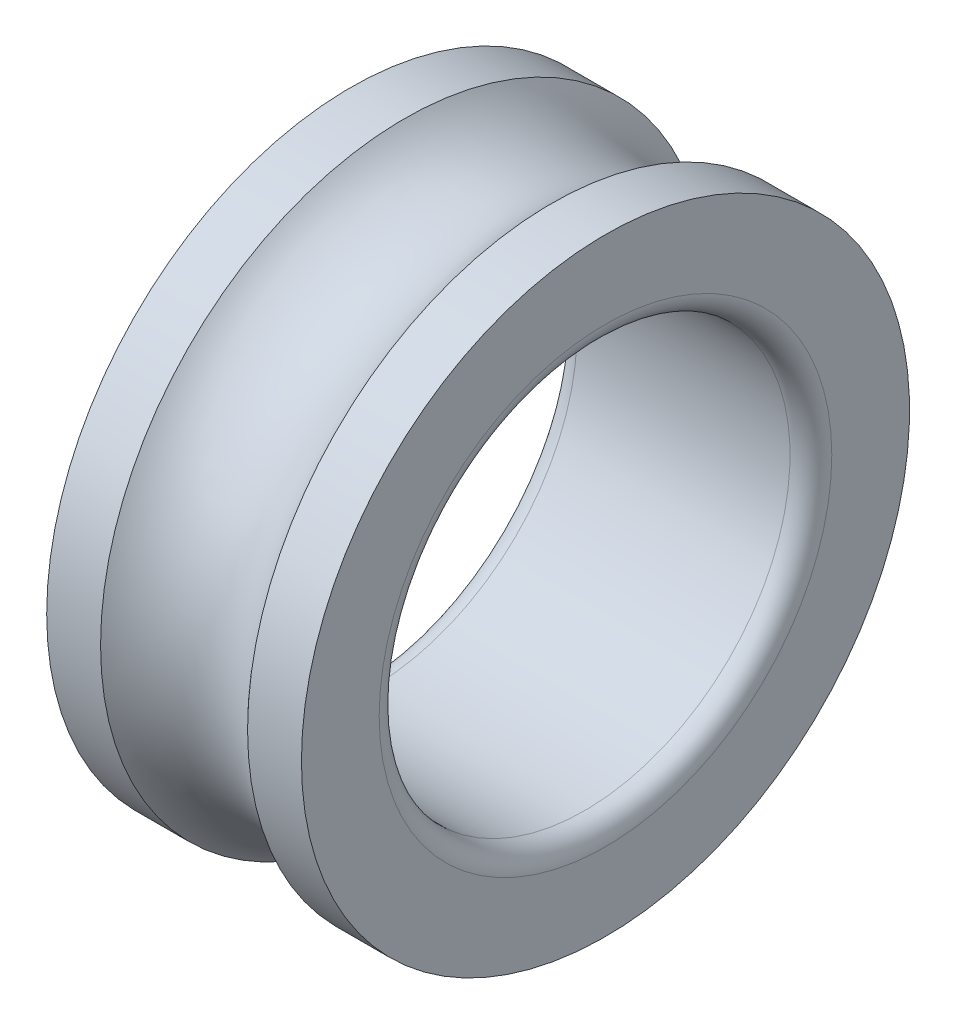
ISO-10303-21;
HEADER;
FILE_DESCRIPTION(('STEP AP214'),'2;1');
FILE_NAME('part.step','',(''),(''),'','','');
FILE_SCHEMA(('AUTOMOTIVE_DESIGN { 1 0 10303 214 1 1 1 1 }'));
ENDSEC;
DATA;
#1=APPLICATION_CONTEXT('core data for automotive mechanical design processes');
#2=APPLICATION_PROTOCOL_DEFINITION('international standard','automotive_design',2000,#1);
#3=PRODUCT_CONTEXT('',#1,'mechanical');
#4=PRODUCT('Part','Part','',(#3));
#5=PRODUCT_RELATED_PRODUCT_CATEGORY('part','',(#4));
#6=PRODUCT_DEFINITION_FORMATION('','',#4);
#7=PRODUCT_DEFINITION_CONTEXT('part definition',#1,'design');
#8=PRODUCT_DEFINITION('design','',#6,#7);
#9=PRODUCT_DEFINITION_SHAPE('','',#8);
#10=(LENGTH_UNIT() NAMED_UNIT(*) SI_UNIT(.MILLI.,.METRE.));
#11=(NAMED_UNIT(*) PLANE_ANGLE_UNIT() SI_UNIT($,.RADIAN.));
#12=(NAMED_UNIT(*) SI_UNIT($,.STERADIAN.) SOLID_ANGLE_UNIT());
#13=UNCERTAINTY_MEASURE_WITH_UNIT(LENGTH_MEASURE(1.E-05),#10,'distance_accuracy_value','');
#14=(GEOMETRIC_REPRESENTATION_CONTEXT(3) GLOBAL_UNCERTAINTY_ASSIGNED_CONTEXT((#13)) GLOBAL_UNIT_ASSIGNED_CONTEXT((#10,
#11,#12)) REPRESENTATION_CONTEXT('',''));
#15=CARTESIAN_POINT('',(0.,0.,0.));
#16=DIRECTION('',(0.,0.,1.));
#17=DIRECTION('',(1.,0.,0.));
#18=AXIS2_PLACEMENT_3D('',#15,#16,#17);
#19=CARTESIAN_POINT('',(-21.910972205,52.30361107,0.));
#20=DIRECTION('',(1.,0.,0.));
#21=DIRECTION('',(0.,0.,-1.));
#22=AXIS2_PLACEMENT_3D('',#19,#20,#21);
#23=PLANE('',#22);
#24=CARTESIAN_POINT('',(-21.910972205,0.,0.));
#25=DIRECTION('',(-1.,0.,0.));
#26=DIRECTION('',(0.,0.,1.));
#27=AXIS2_PLACEMENT_3D('',#24,#25,#26);
#28=CIRCLE('',#27,38.9308499694);
#29=CARTESIAN_POINT('',(-21.910972205,0.,38.9308499694));
#30=VERTEX_POINT('',#29);
#31=EDGE_CURVE('E10',#30,#30,#28,.T.);
#32=ORIENTED_EDGE('',*,*,#31,.F.);
#33=EDGE_LOOP('',(#32));
#34=FACE_BOUND('',#33,.T.);
#35=CARTESIAN_POINT('',(-21.910972205,0.,0.));
#36=DIRECTION('',(-1.,0.,0.));
#37=DIRECTION('',(0.,0.,1.));
#38=AXIS2_PLACEMENT_3D('',#35,#36,#37);
#39=CIRCLE('',#38,52.30361107);
#40=CARTESIAN_POINT('',(-21.910972205,0.,52.30361107));
#41=VERTEX_POINT('',#40);
#42=EDGE_CURVE('E72',#41,#41,#39,.T.);
#43=ORIENTED_EDGE('',*,*,#42,.T.);
#44=EDGE_LOOP('',(#43));
#45=FACE_BOUND('',#44,.T.);
#46=ADVANCED_FACE('F37',(#34,#45),#23,.F.);
#47=CARTESIAN_POINT('',(-18.3203999856,0.,0.));
#48=DIRECTION('',(-1.,0.,0.));
#49=DIRECTION('',(0.,0.,1.));
#50=AXIS2_PLACEMENT_3D('',#47,#48,#49);
#51=TOROIDAL_SURFACE('',#50,38.9308499694,3.5905722194);
#52=CARTESIAN_POINT('',(-18.3203999856,0.,0.));
#53=DIRECTION('',(-1.,0.,0.));
#54=DIRECTION('',(0.,0.,1.));
#55=AXIS2_PLACEMENT_3D('',#52,#53,#54);
#56=CIRCLE('',#55,35.34027775);
#57=CARTESIAN_POINT('',(-18.3203999856,0.,35.34027775));
#58=VERTEX_POINT('',#57);
#59=EDGE_CURVE('E44',#58,#58,#56,.T.);
#60=ORIENTED_EDGE('',*,*,#59,.F.);
#61=EDGE_LOOP('',(#60));
#62=FACE_BOUND('',#61,.T.);
#63=ORIENTED_EDGE('',*,*,#31,.T.);
#64=EDGE_LOOP('',(#63));
#65=FACE_BOUND('',#64,.T.);
#66=ADVANCED_FACE('F110',(#62,#65),#51,.T.);
#67=CARTESIAN_POINT('',(-30.6282407166667,0.,0.));
#68=DIRECTION('',(-1.,0.,0.));
#69=DIRECTION('',(0.,0.,1.));
#70=AXIS2_PLACEMENT_3D('',#67,#68,#69);
#71=CYLINDRICAL_SURFACE('',#70,35.34027775);
#72=CARTESIAN_POINT('',(18.3203999856,0.,0.));
#73=DIRECTION('',(-1.,0.,0.));
#74=DIRECTION('',(0.,0.,1.));
#75=AXIS2_PLACEMENT_3D('',#72,#73,#74);
#76=CIRCLE('',#75,35.34027775);
#77=CARTESIAN_POINT('',(18.3203999856,0.,35.34027775));
#78=VERTEX_POINT('',#77);
#79=EDGE_CURVE('E49',#78,#78,#76,.T.);
#80=ORIENTED_EDGE('',*,*,#79,.F.);
#81=EDGE_LOOP('',(#80));
#82=FACE_BOUND('',#81,.T.);
#83=ORIENTED_EDGE('',*,*,#59,.T.);
#84=EDGE_LOOP('',(#83));
#85=FACE_BOUND('',#84,.T.);
#86=ADVANCED_FACE('F105',(#82,#85),#71,.F.);
#87=CARTESIAN_POINT('',(18.3203999856,0.,0.));
#88=DIRECTION('',(-1.,0.,0.));
#89=DIRECTION('',(0.,0.,1.));
#90=AXIS2_PLACEMENT_3D('',#87,#88,#89);
#91=TOROIDAL_SURFACE('',#90,38.9308499694,3.5905722194);
#92=CARTESIAN_POINT('',(21.910972205,0.,0.));
#93=DIRECTION('',(-1.,0.,0.));
#94=DIRECTION('',(0.,0.,1.));
#95=AXIS2_PLACEMENT_3D('',#92,#93,#94);
#96=CIRCLE('',#95,38.9308499694);
#97=CARTESIAN_POINT('',(21.910972205,0.,38.9308499694));
#98=VERTEX_POINT('',#97);
#99=EDGE_CURVE('E54',#98,#98,#96,.T.);
#100=ORIENTED_EDGE('',*,*,#99,.F.);
#101=EDGE_LOOP('',(#100));
#102=FACE_BOUND('',#101,.T.);
#103=ORIENTED_EDGE('',*,*,#79,.T.);
#104=EDGE_LOOP('',(#103));
#105=FACE_BOUND('',#104,.T.);
#106=ADVANCED_FACE('F99',(#102,#105),#91,.T.);
#107=CARTESIAN_POINT('',(21.910972205,52.30361107,0.));
#108=DIRECTION('',(-1.,0.,0.));
#109=DIRECTION('',(0.,0.,1.));
#110=AXIS2_PLACEMENT_3D('',#107,#108,#109);
#111=PLANE('',#110);
#112=CARTESIAN_POINT('',(21.910972205,0.,0.));
#113=DIRECTION('',(-1.,0.,0.));
#114=DIRECTION('',(0.,0.,1.));
#115=AXIS2_PLACEMENT_3D('',#112,#113,#114);
#116=CIRCLE('',#115,52.30361107);
#117=CARTESIAN_POINT('',(21.910972205,0.,52.30361107));
#118=VERTEX_POINT('',#117);
#119=EDGE_CURVE('E60',#118,#118,#116,.T.);
#120=ORIENTED_EDGE('',*,*,#119,.F.);
#121=EDGE_LOOP('',(#120));
#122=FACE_BOUND('',#121,.T.);
#123=ORIENTED_EDGE('',*,*,#99,.T.);
#124=EDGE_LOOP('',(#123));
#125=FACE_BOUND('',#124,.T.);
#126=ADVANCED_FACE('F93',(#122,#125),#111,.F.);
#127=CARTESIAN_POINT('',(-30.6282407166667,0.,0.));
#128=DIRECTION('',(-1.,0.,0.));
#129=DIRECTION('',(0.,0.,1.));
#130=AXIS2_PLACEMENT_3D('',#127,#128,#129);
#131=CYLINDRICAL_SURFACE('',#130,52.30361107);
#132=CARTESIAN_POINT('',(12.6437221428357,0.,0.));
#133=DIRECTION('',(-1.,0.,0.));
#134=DIRECTION('',(0.,0.,1.));
#135=AXIS2_PLACEMENT_3D('',#132,#133,#134);
#136=CIRCLE('',#135,52.30361107);
#137=CARTESIAN_POINT('',(12.6437221428357,0.,52.30361107));
#138=VERTEX_POINT('',#137);
#139=EDGE_CURVE('E64',#138,#138,#136,.T.);
#140=ORIENTED_EDGE('',*,*,#139,.F.);
#141=EDGE_LOOP('',(#140));
#142=FACE_BOUND('',#141,.T.);
#143=ORIENTED_EDGE('',*,*,#119,.T.);
#144=EDGE_LOOP('',(#143));
#145=FACE_BOUND('',#144,.T.);
#146=ADVANCED_FACE('F87',(#142,#145),#131,.T.);
#147=CARTESIAN_POINT('',(0.,0.,0.));
#148=DIRECTION('',(-1.,0.,0.));
#149=DIRECTION('',(0.,0.,1.));
#150=AXIS2_PLACEMENT_3D('',#147,#148,#149);
#151=TOROIDAL_SURFACE('',#150,63.61249995,16.96333332);
#152=CARTESIAN_POINT('',(-12.6437221428357,0.,0.));
#153=DIRECTION('',(-1.,0.,0.));
#154=DIRECTION('',(0.,0.,1.));
#155=AXIS2_PLACEMENT_3D('',#152,#153,#154);
#156=CIRCLE('',#155,52.30361107);
#157=CARTESIAN_POINT('',(-12.6437221428357,0.,52.30361107));
#158=VERTEX_POINT('',#157);
#159=EDGE_CURVE('E68',#158,#158,#156,.T.);
#160=ORIENTED_EDGE('',*,*,#159,.F.);
#161=EDGE_LOOP('',(#160));
#162=FACE_BOUND('',#161,.T.);
#163=ORIENTED_EDGE('',*,*,#139,.T.);
#164=EDGE_LOOP('',(#163));
#165=FACE_BOUND('',#164,.T.);
#166=ADVANCED_FACE('F81',(#162,#165),#151,.F.);
#167=CARTESIAN_POINT('',(-30.6282407166667,0.,0.));
#168=DIRECTION('',(-1.,0.,0.));
#169=DIRECTION('',(0.,0.,1.));
#170=AXIS2_PLACEMENT_3D('',#167,#168,#169);
#171=CYLINDRICAL_SURFACE('',#170,52.30361107);
#172=ORIENTED_EDGE('',*,*,#42,.F.);
#173=EDGE_LOOP('',(#172));
#174=FACE_BOUND('',#173,.T.);
#175=ORIENTED_EDGE('',*,*,#159,.T.);
#176=EDGE_LOOP('',(#175));
#177=FACE_BOUND('',#176,.T.);
#178=ADVANCED_FACE('F78',(#174,#177),#171,.T.);
#179=CLOSED_SHELL('',(#46,#66,#86,#106,#126,#146,#166,#178));
#180=MANIFOLD_SOLID_BREP('B2',#179);
#181=ADVANCED_BREP_SHAPE_REPRESENTATION('',(#18,#180),#14);
#182=SHAPE_DEFINITION_REPRESENTATION(#9,#181);
ENDSEC;
END-ISO-10303-21;
